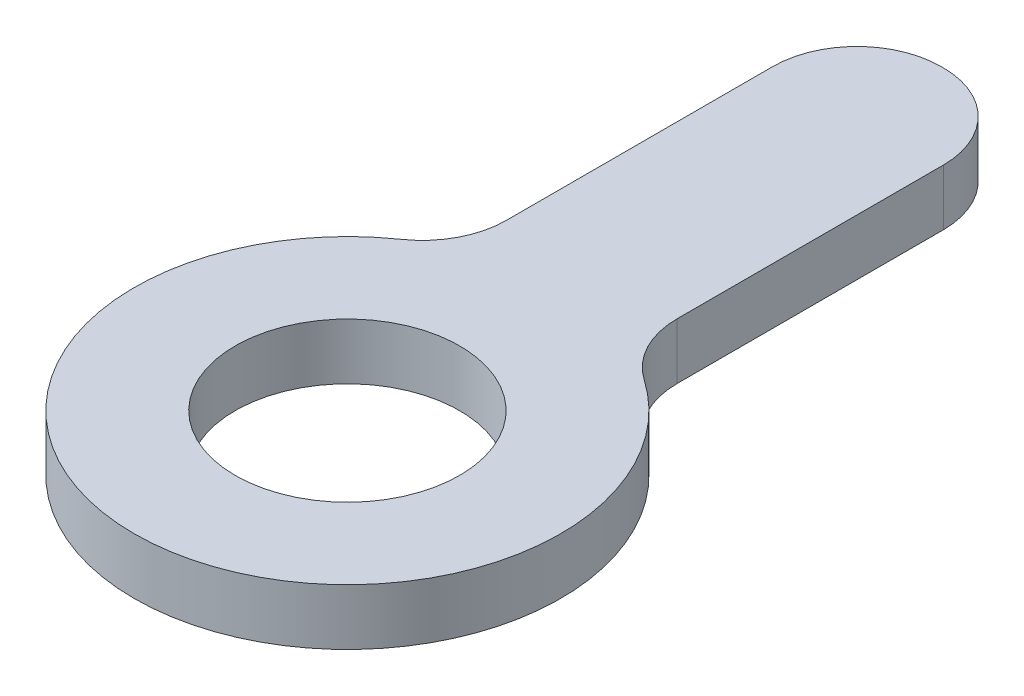
ISO-10303-21;
HEADER;
FILE_DESCRIPTION(('STEP AP214'),'2;1');
FILE_NAME('part.step','',(''),(''),'','','');
FILE_SCHEMA(('AUTOMOTIVE_DESIGN { 1 0 10303 214 1 1 1 1 }'));
ENDSEC;
DATA;
#1=APPLICATION_CONTEXT('core data for automotive mechanical design processes');
#2=APPLICATION_PROTOCOL_DEFINITION('international standard','automotive_design',2000,#1);
#3=PRODUCT_CONTEXT('',#1,'mechanical');
#4=PRODUCT('Part','Part','',(#3));
#5=PRODUCT_RELATED_PRODUCT_CATEGORY('part','',(#4));
#6=PRODUCT_DEFINITION_FORMATION('','',#4);
#7=PRODUCT_DEFINITION_CONTEXT('part definition',#1,'design');
#8=PRODUCT_DEFINITION('design','',#6,#7);
#9=PRODUCT_DEFINITION_SHAPE('','',#8);
#10=(LENGTH_UNIT() NAMED_UNIT(*) SI_UNIT(.MILLI.,.METRE.));
#11=(NAMED_UNIT(*) PLANE_ANGLE_UNIT() SI_UNIT($,.RADIAN.));
#12=(NAMED_UNIT(*) SI_UNIT($,.STERADIAN.) SOLID_ANGLE_UNIT());
#13=UNCERTAINTY_MEASURE_WITH_UNIT(LENGTH_MEASURE(1.E-05),#10,'distance_accuracy_value','');
#14=(GEOMETRIC_REPRESENTATION_CONTEXT(3) GLOBAL_UNCERTAINTY_ASSIGNED_CONTEXT((#13)) GLOBAL_UNIT_ASSIGNED_CONTEXT((#10,
#11,#12)) REPRESENTATION_CONTEXT('',''));
#15=CARTESIAN_POINT('',(0.,0.,0.));
#16=DIRECTION('',(0.,0.,1.));
#17=DIRECTION('',(1.,0.,0.));
#18=AXIS2_PLACEMENT_3D('',#15,#16,#17);
#19=CARTESIAN_POINT('',(4.82599999999997,3.175,0.));
#20=DIRECTION('',(1.,0.,0.));
#21=DIRECTION('',(0.,0.,-1.));
#22=AXIS2_PLACEMENT_3D('',#19,#20,#21);
#23=PLANE('',#22);
#24=DIRECTION('',(0.,0.,1.));
#25=VECTOR('',#24,1.);
#26=CARTESIAN_POINT('',(4.82599999999997,0.,0.));
#27=LINE('',#26,#25);
#28=CARTESIAN_POINT('',(4.82600000000006,0.,-28.8925));
#29=VERTEX_POINT('',#28);
#30=CARTESIAN_POINT('',(4.82600000000001,0.,-13.8284281102373));
#31=VERTEX_POINT('',#30);
#32=EDGE_CURVE('E166',#29,#31,#27,.T.);
#33=ORIENTED_EDGE('',*,*,#32,.F.);
#34=DIRECTION('',(0.,-1.,0.));
#35=VECTOR('',#34,1.);
#36=CARTESIAN_POINT('',(4.82600000000006,3.175,-28.8925));
#37=LINE('',#36,#35);
#38=CARTESIAN_POINT('',(4.82600000000006,3.175,-28.8925));
#39=VERTEX_POINT('',#38);
#40=EDGE_CURVE('E143',#29,#39,#37,.F.);
#41=ORIENTED_EDGE('',*,*,#40,.T.);
#42=DIRECTION('',(0.,0.,1.));
#43=VECTOR('',#42,1.);
#44=CARTESIAN_POINT('',(4.82599999999997,3.175,0.));
#45=LINE('',#44,#43);
#46=CARTESIAN_POINT('',(4.82600000000001,3.175,-13.8284281102373));
#47=VERTEX_POINT('',#46);
#48=EDGE_CURVE('E155',#39,#47,#45,.T.);
#49=ORIENTED_EDGE('',*,*,#48,.T.);
#50=DIRECTION('',(0.,-1.,0.));
#51=VECTOR('',#50,1.);
#52=CARTESIAN_POINT('',(4.82600000000001,3.175,-13.8284281102373));
#53=LINE('',#52,#51);
#54=EDGE_CURVE('E140',#47,#31,#53,.T.);
#55=ORIENTED_EDGE('',*,*,#54,.T.);
#56=EDGE_LOOP('',(#33,#41,#49,#55));
#57=FACE_BOUND('',#56,.T.);
#58=ADVANCED_FACE('F37',(#57),#23,.T.);
#59=CARTESIAN_POINT('',(0.,3.175,-33.655));
#60=DIRECTION('',(0.,0.,-1.));
#61=DIRECTION('',(-1.,0.,0.));
#62=AXIS2_PLACEMENT_3D('',#59,#60,#61);
#63=PLANE('',#62);
#64=DIRECTION('',(1.,0.,0.));
#65=VECTOR('',#64,1.);
#66=CARTESIAN_POINT('',(0.,0.,-33.655));
#67=LINE('',#66,#65);
#68=CARTESIAN_POINT('',(-0.0635000000000584,0.,-33.655));
#69=VERTEX_POINT('',#68);
#70=CARTESIAN_POINT('',(0.0635000000000584,0.,-33.655));
#71=VERTEX_POINT('',#70);
#72=EDGE_CURVE('E118',#69,#71,#67,.T.);
#73=ORIENTED_EDGE('',*,*,#72,.F.);
#74=DIRECTION('',(0.,-1.,0.));
#75=VECTOR('',#74,1.);
#76=CARTESIAN_POINT('',(-0.0635000000000584,3.175,-33.655));
#77=LINE('',#76,#75);
#78=CARTESIAN_POINT('',(-0.0635000000000584,3.175,-33.655));
#79=VERTEX_POINT('',#78);
#80=EDGE_CURVE('E134',#69,#79,#77,.F.);
#81=ORIENTED_EDGE('',*,*,#80,.T.);
#82=DIRECTION('',(1.,0.,0.));
#83=VECTOR('',#82,1.);
#84=CARTESIAN_POINT('',(0.,3.175,-33.655));
#85=LINE('',#84,#83);
#86=CARTESIAN_POINT('',(0.0635000000000584,3.175,-33.655));
#87=VERTEX_POINT('',#86);
#88=EDGE_CURVE('E163',#79,#87,#85,.T.);
#89=ORIENTED_EDGE('',*,*,#88,.T.);
#90=DIRECTION('',(0.,-1.,0.));
#91=VECTOR('',#90,1.);
#92=CARTESIAN_POINT('',(0.0635000000000584,3.175,-33.655));
#93=LINE('',#92,#91);
#94=EDGE_CURVE('E131',#87,#71,#93,.T.);
#95=ORIENTED_EDGE('',*,*,#94,.T.);
#96=EDGE_LOOP('',(#73,#81,#89,#95));
#97=FACE_BOUND('',#96,.T.);
#98=ADVANCED_FACE('F176',(#97),#63,.T.);
#99=CARTESIAN_POINT('',(-4.82599999999997,3.175,0.));
#100=DIRECTION('',(-1.,0.,0.));
#101=DIRECTION('',(0.,0.,1.));
#102=AXIS2_PLACEMENT_3D('',#99,#100,#101);
#103=PLANE('',#102);
#104=DIRECTION('',(0.,0.,-1.));
#105=VECTOR('',#104,1.);
#106=CARTESIAN_POINT('',(-4.82599999999997,3.175,0.));
#107=LINE('',#106,#105);
#108=CARTESIAN_POINT('',(-4.82600000000001,3.175,-13.8284281102373));
#109=VERTEX_POINT('',#108);
#110=CARTESIAN_POINT('',(-4.82600000000006,3.175,-28.8925));
#111=VERTEX_POINT('',#110);
#112=EDGE_CURVE('E124',#109,#111,#107,.T.);
#113=ORIENTED_EDGE('',*,*,#112,.T.);
#114=DIRECTION('',(0.,-1.,0.));
#115=VECTOR('',#114,1.);
#116=CARTESIAN_POINT('',(-4.82600000000006,3.175,-28.8925));
#117=LINE('',#116,#115);
#118=CARTESIAN_POINT('',(-4.82600000000006,0.,-28.8925));
#119=VERTEX_POINT('',#118);
#120=EDGE_CURVE('E117',#111,#119,#117,.T.);
#121=ORIENTED_EDGE('',*,*,#120,.T.);
#122=DIRECTION('',(0.,0.,-1.));
#123=VECTOR('',#122,1.);
#124=CARTESIAN_POINT('',(-4.82599999999997,0.,0.));
#125=LINE('',#124,#123);
#126=CARTESIAN_POINT('',(-4.82600000000001,0.,-13.8284281102373));
#127=VERTEX_POINT('',#126);
#128=EDGE_CURVE('E104',#127,#119,#125,.T.);
#129=ORIENTED_EDGE('',*,*,#128,.F.);
#130=DIRECTION('',(0.,-1.,0.));
#131=VECTOR('',#130,1.);
#132=CARTESIAN_POINT('',(-4.82600000000001,3.175,-13.8284281102373));
#133=LINE('',#132,#131);
#134=EDGE_CURVE('E115',#127,#109,#133,.F.);
#135=ORIENTED_EDGE('',*,*,#134,.T.);
#136=EDGE_LOOP('',(#113,#121,#129,#135));
#137=FACE_BOUND('',#136,.T.);
#138=ADVANCED_FACE('F114',(#137),#103,.T.);
#139=CARTESIAN_POINT('',(0.,3.175,0.));
#140=DIRECTION('',(0.,-1.,0.));
#141=DIRECTION('',(0.,0.,-1.));
#142=AXIS2_PLACEMENT_3D('',#139,#140,#141);
#143=CYLINDRICAL_SURFACE('',#142,12.065);
#144=CARTESIAN_POINT('',(0.,0.,0.));
#145=DIRECTION('',(0.,1.,0.));
#146=DIRECTION('',(0.,0.,1.));
#147=AXIS2_PLACEMENT_3D('',#144,#145,#146);
#148=CIRCLE('',#147,12.065);
#149=CARTESIAN_POINT('',(-6.87477358490567,0.,-9.91472204130218));
#150=VERTEX_POINT('',#149);
#151=CARTESIAN_POINT('',(6.87477358490567,0.,-9.91472204130218));
#152=VERTEX_POINT('',#151);
#153=EDGE_CURVE('E105',#150,#152,#148,.T.);
#154=ORIENTED_EDGE('',*,*,#153,.T.);
#155=DIRECTION('',(0.,-1.,0.));
#156=VECTOR('',#155,1.);
#157=CARTESIAN_POINT('',(6.87477358490567,3.175,-9.91472204130218));
#158=LINE('',#157,#156);
#159=CARTESIAN_POINT('',(6.87477358490567,3.175,-9.91472204130218));
#160=VERTEX_POINT('',#159);
#161=EDGE_CURVE('E52',#152,#160,#158,.F.);
#162=ORIENTED_EDGE('',*,*,#161,.T.);
#163=CARTESIAN_POINT('',(0.,3.175,0.));
#164=DIRECTION('',(0.,1.,0.));
#165=DIRECTION('',(0.,0.,1.));
#166=AXIS2_PLACEMENT_3D('',#163,#164,#165);
#167=CIRCLE('',#166,12.065);
#168=CARTESIAN_POINT('',(-6.87477358490567,3.175,-9.91472204130218));
#169=VERTEX_POINT('',#168);
#170=EDGE_CURVE('E120',#169,#160,#167,.T.);
#171=ORIENTED_EDGE('',*,*,#170,.F.);
#172=DIRECTION('',(0.,-1.,0.));
#173=VECTOR('',#172,1.);
#174=CARTESIAN_POINT('',(-6.87477358490567,3.175,-9.91472204130218));
#175=LINE('',#174,#173);
#176=EDGE_CURVE('E145',#169,#150,#175,.T.);
#177=ORIENTED_EDGE('',*,*,#176,.T.);
#178=EDGE_LOOP('',(#154,#162,#171,#177));
#179=FACE_BOUND('',#178,.T.);
#180=ADVANCED_FACE('F167',(#179),#143,.T.);
#181=CARTESIAN_POINT('',(0.,3.175,0.));
#182=DIRECTION('',(0.,1.,0.));
#183=DIRECTION('',(0.,0.,1.));
#184=AXIS2_PLACEMENT_3D('',#181,#182,#183);
#185=PLANE('',#184);
#186=CARTESIAN_POINT('',(0.,3.175,0.));
#187=DIRECTION('',(0.,1.,0.));
#188=DIRECTION('',(0.,0.,1.));
#189=AXIS2_PLACEMENT_3D('',#186,#187,#188);
#190=CIRCLE('',#189,6.35);
#191=CARTESIAN_POINT('',(0.,3.175,6.35));
#192=VERTEX_POINT('',#191);
#193=EDGE_CURVE('E214',#192,#192,#190,.T.);
#194=ORIENTED_EDGE('',*,*,#193,.F.);
#195=EDGE_LOOP('',(#194));
#196=FACE_BOUND('',#195,.T.);
#197=ORIENTED_EDGE('',*,*,#88,.F.);
#198=CARTESIAN_POINT('',(-0.0635000000000584,3.175,-28.8925));
#199=DIRECTION('',(0.,1.,0.));
#200=DIRECTION('',(0.,0.,1.));
#201=AXIS2_PLACEMENT_3D('',#198,#199,#200);
#202=CIRCLE('',#201,4.7625);
#203=EDGE_CURVE('E138',#79,#111,#202,.T.);
#204=ORIENTED_EDGE('',*,*,#203,.T.);
#205=ORIENTED_EDGE('',*,*,#112,.F.);
#206=CARTESIAN_POINT('',(-9.58850000000001,3.175,-13.8284281102372));
#207=DIRECTION('',(0.,1.,0.));
#208=DIRECTION('',(0.,0.,1.));
#209=AXIS2_PLACEMENT_3D('',#206,#207,#208);
#210=CIRCLE('',#209,4.7625);
#211=EDGE_CURVE('E11',#109,#169,#210,.F.);
#212=ORIENTED_EDGE('',*,*,#211,.T.);
#213=ORIENTED_EDGE('',*,*,#170,.T.);
#214=CARTESIAN_POINT('',(9.58850000000001,3.175,-13.8284281102372));
#215=DIRECTION('',(0.,1.,0.));
#216=DIRECTION('',(0.,0.,1.));
#217=AXIS2_PLACEMENT_3D('',#214,#215,#216);
#218=CIRCLE('',#217,4.7625);
#219=EDGE_CURVE('E110',#160,#47,#218,.F.);
#220=ORIENTED_EDGE('',*,*,#219,.T.);
#221=ORIENTED_EDGE('',*,*,#48,.F.);
#222=CARTESIAN_POINT('',(0.0635000000000584,3.175,-28.8925));
#223=DIRECTION('',(0.,1.,0.));
#224=DIRECTION('',(0.,0.,1.));
#225=AXIS2_PLACEMENT_3D('',#222,#223,#224);
#226=CIRCLE('',#225,4.7625);
#227=EDGE_CURVE('E136',#39,#87,#226,.T.);
#228=ORIENTED_EDGE('',*,*,#227,.T.);
#229=EDGE_LOOP('',(#197,#204,#205,#212,#213,#220,#221,#228));
#230=FACE_BOUND('',#229,.T.);
#231=ADVANCED_FACE('F154',(#196,#230),#185,.T.);
#232=CARTESIAN_POINT('',(0.,0.,0.));
#233=DIRECTION('',(0.,1.,0.));
#234=DIRECTION('',(0.,0.,1.));
#235=AXIS2_PLACEMENT_3D('',#232,#233,#234);
#236=PLANE('',#235);
#237=CARTESIAN_POINT('',(0.,0.,0.));
#238=DIRECTION('',(0.,1.,0.));
#239=DIRECTION('',(0.,0.,1.));
#240=AXIS2_PLACEMENT_3D('',#237,#238,#239);
#241=CIRCLE('',#240,6.35);
#242=CARTESIAN_POINT('',(0.,0.,6.35));
#243=VERTEX_POINT('',#242);
#244=EDGE_CURVE('E213',#243,#243,#241,.T.);
#245=ORIENTED_EDGE('',*,*,#244,.T.);
#246=EDGE_LOOP('',(#245));
#247=FACE_BOUND('',#246,.T.);
#248=ORIENTED_EDGE('',*,*,#128,.T.);
#249=CARTESIAN_POINT('',(-0.0635000000000584,0.,-28.8925));
#250=DIRECTION('',(0.,1.,0.));
#251=DIRECTION('',(0.,0.,1.));
#252=AXIS2_PLACEMENT_3D('',#249,#250,#251);
#253=CIRCLE('',#252,4.7625);
#254=EDGE_CURVE('E129',#119,#69,#253,.F.);
#255=ORIENTED_EDGE('',*,*,#254,.T.);
#256=ORIENTED_EDGE('',*,*,#72,.T.);
#257=CARTESIAN_POINT('',(0.0635000000000584,0.,-28.8925));
#258=DIRECTION('',(0.,1.,0.));
#259=DIRECTION('',(0.,0.,1.));
#260=AXIS2_PLACEMENT_3D('',#257,#258,#259);
#261=CIRCLE('',#260,4.7625);
#262=EDGE_CURVE('E122',#71,#29,#261,.F.);
#263=ORIENTED_EDGE('',*,*,#262,.T.);
#264=ORIENTED_EDGE('',*,*,#32,.T.);
#265=CARTESIAN_POINT('',(9.58850000000001,0.,-13.8284281102372));
#266=DIRECTION('',(0.,1.,0.));
#267=DIRECTION('',(0.,0.,1.));
#268=AXIS2_PLACEMENT_3D('',#265,#266,#267);
#269=CIRCLE('',#268,4.7625);
#270=EDGE_CURVE('E148',#31,#152,#269,.T.);
#271=ORIENTED_EDGE('',*,*,#270,.T.);
#272=ORIENTED_EDGE('',*,*,#153,.F.);
#273=CARTESIAN_POINT('',(-9.58850000000001,0.,-13.8284281102372));
#274=DIRECTION('',(0.,1.,0.));
#275=DIRECTION('',(0.,0.,1.));
#276=AXIS2_PLACEMENT_3D('',#273,#274,#275);
#277=CIRCLE('',#276,4.7625);
#278=EDGE_CURVE('E45',#150,#127,#277,.T.);
#279=ORIENTED_EDGE('',*,*,#278,.T.);
#280=EDGE_LOOP('',(#248,#255,#256,#263,#264,#271,#272,#279));
#281=FACE_BOUND('',#280,.T.);
#282=ADVANCED_FACE('F103',(#247,#281),#236,.F.);
#283=CARTESIAN_POINT('',(-0.0635000000000584,3.175,-28.8925));
#284=DIRECTION('',(0.,-1.,0.));
#285=DIRECTION('',(0.,0.,-1.));
#286=AXIS2_PLACEMENT_3D('',#283,#284,#285);
#287=CYLINDRICAL_SURFACE('',#286,4.7625);
#288=ORIENTED_EDGE('',*,*,#203,.F.);
#289=ORIENTED_EDGE('',*,*,#80,.F.);
#290=ORIENTED_EDGE('',*,*,#254,.F.);
#291=ORIENTED_EDGE('',*,*,#120,.F.);
#292=EDGE_LOOP('',(#288,#289,#290,#291));
#293=FACE_BOUND('',#292,.T.);
#294=ADVANCED_FACE('F187',(#293),#287,.T.);
#295=CARTESIAN_POINT('',(0.0635000000000584,3.175,-28.8925));
#296=DIRECTION('',(0.,-1.,0.));
#297=DIRECTION('',(0.,0.,-1.));
#298=AXIS2_PLACEMENT_3D('',#295,#296,#297);
#299=CYLINDRICAL_SURFACE('',#298,4.7625);
#300=ORIENTED_EDGE('',*,*,#227,.F.);
#301=ORIENTED_EDGE('',*,*,#40,.F.);
#302=ORIENTED_EDGE('',*,*,#262,.F.);
#303=ORIENTED_EDGE('',*,*,#94,.F.);
#304=EDGE_LOOP('',(#300,#301,#302,#303));
#305=FACE_BOUND('',#304,.T.);
#306=ADVANCED_FACE('F190',(#305),#299,.T.);
#307=CARTESIAN_POINT('',(9.58850000000001,3.175,-13.8284281102372));
#308=DIRECTION('',(0.,-1.,0.));
#309=DIRECTION('',(0.,0.,-1.));
#310=AXIS2_PLACEMENT_3D('',#307,#308,#309);
#311=CYLINDRICAL_SURFACE('',#310,4.7625);
#312=ORIENTED_EDGE('',*,*,#219,.F.);
#313=ORIENTED_EDGE('',*,*,#161,.F.);
#314=ORIENTED_EDGE('',*,*,#270,.F.);
#315=ORIENTED_EDGE('',*,*,#54,.F.);
#316=EDGE_LOOP('',(#312,#313,#314,#315));
#317=FACE_BOUND('',#316,.T.);
#318=ADVANCED_FACE('F165',(#317),#311,.F.);
#319=CARTESIAN_POINT('',(-9.58850000000001,3.175,-13.8284281102372));
#320=DIRECTION('',(0.,-1.,0.));
#321=DIRECTION('',(0.,0.,-1.));
#322=AXIS2_PLACEMENT_3D('',#319,#320,#321);
#323=CYLINDRICAL_SURFACE('',#322,4.7625);
#324=ORIENTED_EDGE('',*,*,#211,.F.);
#325=ORIENTED_EDGE('',*,*,#134,.F.);
#326=ORIENTED_EDGE('',*,*,#278,.F.);
#327=ORIENTED_EDGE('',*,*,#176,.F.);
#328=EDGE_LOOP('',(#324,#325,#326,#327));
#329=FACE_BOUND('',#328,.T.);
#330=ADVANCED_FACE('F39',(#329),#323,.F.);
#331=CARTESIAN_POINT('',(0.,0.,0.));
#332=DIRECTION('',(0.,1.,0.));
#333=DIRECTION('',(0.,0.,1.));
#334=AXIS2_PLACEMENT_3D('',#331,#332,#333);
#335=CYLINDRICAL_SURFACE('',#334,6.35);
#336=ORIENTED_EDGE('',*,*,#244,.F.);
#337=EDGE_LOOP('',(#336));
#338=FACE_BOUND('',#337,.T.);
#339=ORIENTED_EDGE('',*,*,#193,.T.);
#340=EDGE_LOOP('',(#339));
#341=FACE_BOUND('',#340,.T.);
#342=ADVANCED_FACE('F198',(#338,#341),#335,.F.);
#343=CLOSED_SHELL('',(#58,#98,#138,#180,#231,#282,#294,#306,#318,#330,#342));
#344=MANIFOLD_SOLID_BREP('B2',#343);
#345=ADVANCED_BREP_SHAPE_REPRESENTATION('',(#18,#344),#14);
#346=SHAPE_DEFINITION_REPRESENTATION(#9,#345);
ENDSEC;
END-ISO-10303-21;
